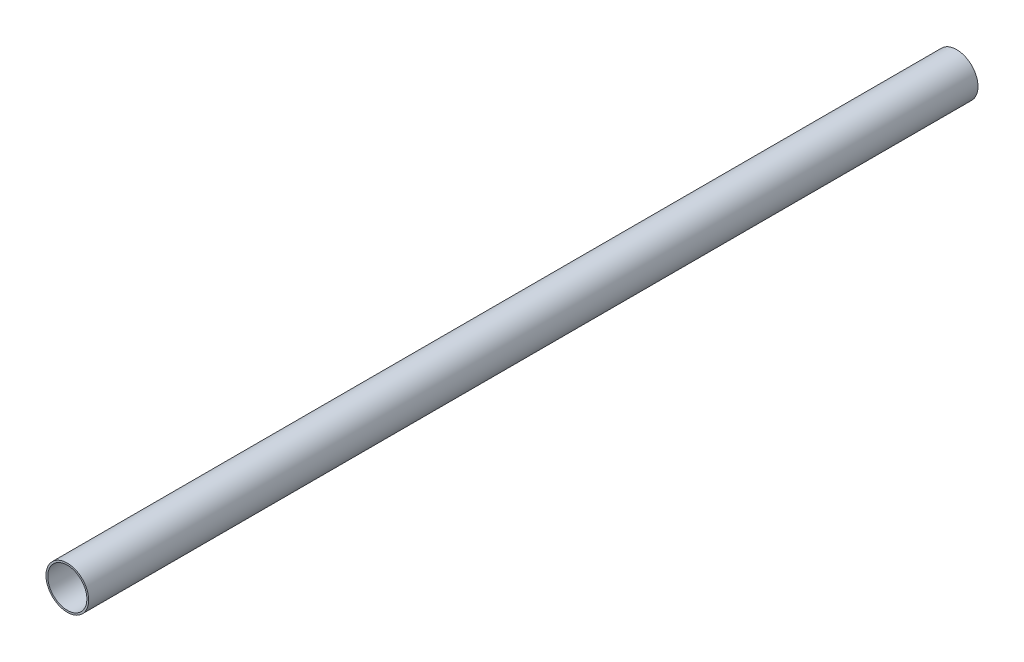
ISO-10303-21;
HEADER;
FILE_DESCRIPTION(('STEP AP214'),'2;1');
FILE_NAME('part.step','',(''),(''),'','','');
FILE_SCHEMA(('AUTOMOTIVE_DESIGN { 1 0 10303 214 1 1 1 1 }'));
ENDSEC;
DATA;
#1=APPLICATION_CONTEXT('core data for automotive mechanical design processes');
#2=APPLICATION_PROTOCOL_DEFINITION('international standard','automotive_design',2000,#1);
#3=PRODUCT_CONTEXT('',#1,'mechanical');
#4=PRODUCT('Part','Part','',(#3));
#5=PRODUCT_RELATED_PRODUCT_CATEGORY('part','',(#4));
#6=PRODUCT_DEFINITION_FORMATION('','',#4);
#7=PRODUCT_DEFINITION_CONTEXT('part definition',#1,'design');
#8=PRODUCT_DEFINITION('design','',#6,#7);
#9=PRODUCT_DEFINITION_SHAPE('','',#8);
#10=(LENGTH_UNIT() NAMED_UNIT(*) SI_UNIT(.MILLI.,.METRE.));
#11=(NAMED_UNIT(*) PLANE_ANGLE_UNIT() SI_UNIT($,.RADIAN.));
#12=(NAMED_UNIT(*) SI_UNIT($,.STERADIAN.) SOLID_ANGLE_UNIT());
#13=UNCERTAINTY_MEASURE_WITH_UNIT(LENGTH_MEASURE(1.E-05),#10,'distance_accuracy_value','');
#14=(GEOMETRIC_REPRESENTATION_CONTEXT(3) GLOBAL_UNCERTAINTY_ASSIGNED_CONTEXT((#13)) GLOBAL_UNIT_ASSIGNED_CONTEXT((#10,
#11,#12)) REPRESENTATION_CONTEXT('',''));
#15=CARTESIAN_POINT('',(0.,0.,0.));
#16=DIRECTION('',(0.,0.,1.));
#17=DIRECTION('',(1.,0.,0.));
#18=AXIS2_PLACEMENT_3D('',#15,#16,#17);
#19=CARTESIAN_POINT('',(0.,0.,250.));
#20=DIRECTION('',(0.,0.,1.));
#21=DIRECTION('',(1.,0.,0.));
#22=AXIS2_PLACEMENT_3D('',#19,#20,#21);
#23=PLANE('',#22);
#24=CARTESIAN_POINT('',(0.,0.,250.));
#25=DIRECTION('',(0.,0.,1.));
#26=DIRECTION('',(1.,0.,0.));
#27=AXIS2_PLACEMENT_3D('',#24,#25,#26);
#28=CIRCLE('',#27,6.);
#29=CARTESIAN_POINT('',(6.,0.,250.));
#30=VERTEX_POINT('',#29);
#31=EDGE_CURVE('E10',#30,#30,#28,.T.);
#32=ORIENTED_EDGE('',*,*,#31,.T.);
#33=EDGE_LOOP('',(#32));
#34=FACE_BOUND('',#33,.T.);
#35=CARTESIAN_POINT('',(0.,0.,250.));
#36=DIRECTION('',(0.,0.,1.));
#37=DIRECTION('',(1.,0.,0.));
#38=AXIS2_PLACEMENT_3D('',#35,#36,#37);
#39=CIRCLE('',#38,5.5);
#40=CARTESIAN_POINT('',(5.5,0.,250.));
#41=VERTEX_POINT('',#40);
#42=EDGE_CURVE('E42',#41,#41,#39,.T.);
#43=ORIENTED_EDGE('',*,*,#42,.F.);
#44=EDGE_LOOP('',(#43));
#45=FACE_BOUND('',#44,.T.);
#46=ADVANCED_FACE('F31',(#34,#45),#23,.T.);
#47=CARTESIAN_POINT('',(0.,0.,0.));
#48=DIRECTION('',(0.,0.,1.));
#49=DIRECTION('',(1.,0.,0.));
#50=AXIS2_PLACEMENT_3D('',#47,#48,#49);
#51=PLANE('',#50);
#52=CARTESIAN_POINT('',(0.,0.,0.));
#53=DIRECTION('',(0.,0.,1.));
#54=DIRECTION('',(1.,0.,0.));
#55=AXIS2_PLACEMENT_3D('',#52,#53,#54);
#56=CIRCLE('',#55,6.);
#57=CARTESIAN_POINT('',(6.,0.,0.));
#58=VERTEX_POINT('',#57);
#59=EDGE_CURVE('E35',#58,#58,#56,.T.);
#60=ORIENTED_EDGE('',*,*,#59,.F.);
#61=EDGE_LOOP('',(#60));
#62=FACE_BOUND('',#61,.T.);
#63=CARTESIAN_POINT('',(0.,0.,0.));
#64=DIRECTION('',(0.,0.,1.));
#65=DIRECTION('',(1.,0.,0.));
#66=AXIS2_PLACEMENT_3D('',#63,#64,#65);
#67=CIRCLE('',#66,5.5);
#68=CARTESIAN_POINT('',(5.5,0.,0.));
#69=VERTEX_POINT('',#68);
#70=EDGE_CURVE('E44',#69,#69,#67,.T.);
#71=ORIENTED_EDGE('',*,*,#70,.T.);
#72=EDGE_LOOP('',(#71));
#73=FACE_BOUND('',#72,.T.);
#74=ADVANCED_FACE('F54',(#62,#73),#51,.F.);
#75=CARTESIAN_POINT('',(0.,0.,250.));
#76=DIRECTION('',(0.,0.,-1.));
#77=DIRECTION('',(-1.,0.,0.));
#78=AXIS2_PLACEMENT_3D('',#75,#76,#77);
#79=CYLINDRICAL_SURFACE('',#78,6.);
#80=ORIENTED_EDGE('',*,*,#31,.F.);
#81=EDGE_LOOP('',(#80));
#82=FACE_BOUND('',#81,.T.);
#83=ORIENTED_EDGE('',*,*,#59,.T.);
#84=EDGE_LOOP('',(#83));
#85=FACE_BOUND('',#84,.T.);
#86=ADVANCED_FACE('F33',(#82,#85),#79,.T.);
#87=CARTESIAN_POINT('',(0.,0.,250.));
#88=DIRECTION('',(0.,0.,-1.));
#89=DIRECTION('',(-1.,0.,0.));
#90=AXIS2_PLACEMENT_3D('',#87,#88,#89);
#91=CYLINDRICAL_SURFACE('',#90,5.5);
#92=ORIENTED_EDGE('',*,*,#42,.T.);
#93=EDGE_LOOP('',(#92));
#94=FACE_BOUND('',#93,.T.);
#95=ORIENTED_EDGE('',*,*,#70,.F.);
#96=EDGE_LOOP('',(#95));
#97=FACE_BOUND('',#96,.T.);
#98=ADVANCED_FACE('F50',(#94,#97),#91,.F.);
#99=CLOSED_SHELL('',(#46,#74,#86,#98));
#100=MANIFOLD_SOLID_BREP('B2',#99);
#101=ADVANCED_BREP_SHAPE_REPRESENTATION('',(#18,#100),#14);
#102=SHAPE_DEFINITION_REPRESENTATION(#9,#101);
ENDSEC;
END-ISO-10303-21;
